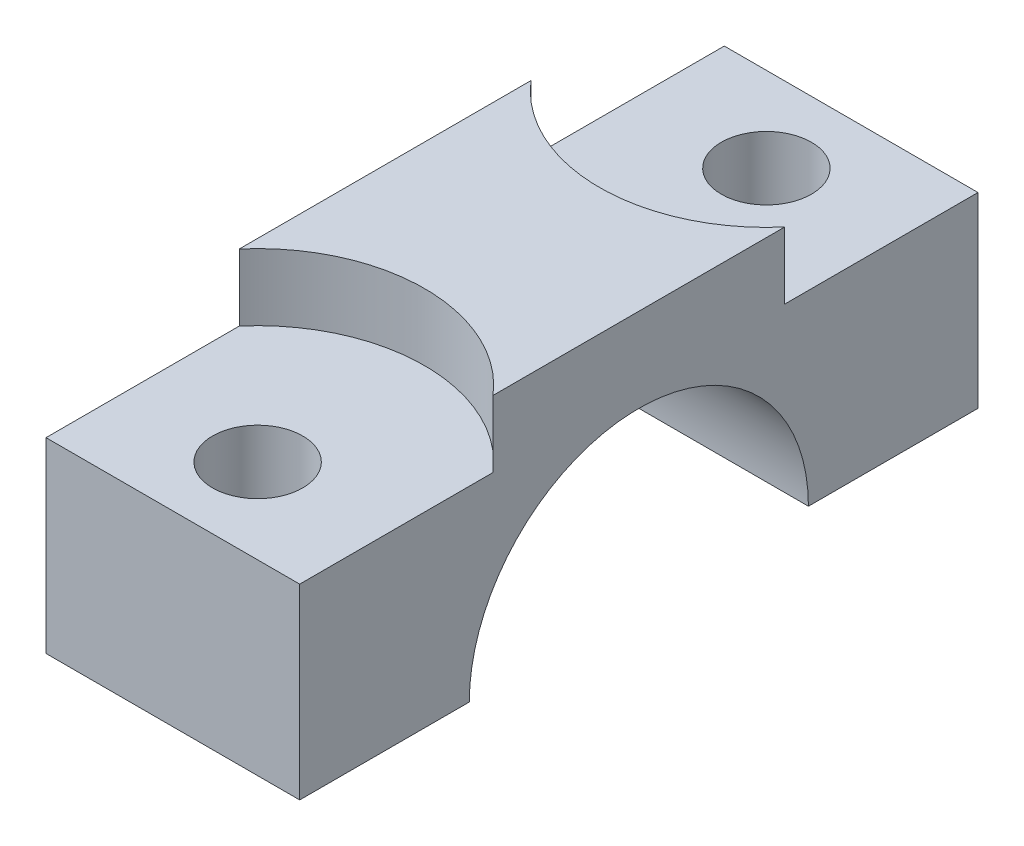
ISO-10303-21;
HEADER;
FILE_DESCRIPTION(('STEP AP214'),'2;1');
FILE_NAME('part.step','',(''),(''),'','','');
FILE_SCHEMA(('AUTOMOTIVE_DESIGN { 1 0 10303 214 1 1 1 1 }'));
ENDSEC;
DATA;
#1=APPLICATION_CONTEXT('core data for automotive mechanical design processes');
#2=APPLICATION_PROTOCOL_DEFINITION('international standard','automotive_design',2000,#1);
#3=PRODUCT_CONTEXT('',#1,'mechanical');
#4=PRODUCT('Part','Part','',(#3));
#5=PRODUCT_RELATED_PRODUCT_CATEGORY('part','',(#4));
#6=PRODUCT_DEFINITION_FORMATION('','',#4);
#7=PRODUCT_DEFINITION_CONTEXT('part definition',#1,'design');
#8=PRODUCT_DEFINITION('design','',#6,#7);
#9=PRODUCT_DEFINITION_SHAPE('','',#8);
#10=(LENGTH_UNIT() NAMED_UNIT(*) SI_UNIT(.MILLI.,.METRE.));
#11=(NAMED_UNIT(*) PLANE_ANGLE_UNIT() SI_UNIT($,.RADIAN.));
#12=(NAMED_UNIT(*) SI_UNIT($,.STERADIAN.) SOLID_ANGLE_UNIT());
#13=UNCERTAINTY_MEASURE_WITH_UNIT(LENGTH_MEASURE(1.E-05),#10,'distance_accuracy_value','');
#14=(GEOMETRIC_REPRESENTATION_CONTEXT(3) GLOBAL_UNCERTAINTY_ASSIGNED_CONTEXT((#13)) GLOBAL_UNIT_ASSIGNED_CONTEXT((#10,
#11,#12)) REPRESENTATION_CONTEXT('',''));
#15=CARTESIAN_POINT('',(0.,0.,0.));
#16=DIRECTION('',(0.,0.,1.));
#17=DIRECTION('',(1.,0.,0.));
#18=AXIS2_PLACEMENT_3D('',#15,#16,#17);
#19=CARTESIAN_POINT('',(9.5,19.,25.4));
#20=DIRECTION('',(0.,-1.,0.));
#21=DIRECTION('',(0.,0.,-1.));
#22=AXIS2_PLACEMENT_3D('',#19,#20,#21);
#23=PLANE('',#22);
#24=CARTESIAN_POINT('',(0.,19.,-19.05));
#25=DIRECTION('',(0.,1.,0.));
#26=DIRECTION('',(0.,0.,1.));
#27=AXIS2_PLACEMENT_3D('',#24,#25,#26);
#28=CIRCLE('',#27,12.5);
#29=CARTESIAN_POINT('',(-9.5,19.,-10.925961595364));
#30=VERTEX_POINT('',#29);
#31=CARTESIAN_POINT('',(9.5,19.,-10.925961595364));
#32=VERTEX_POINT('',#31);
#33=EDGE_CURVE('E120',#30,#32,#28,.T.);
#34=ORIENTED_EDGE('',*,*,#33,.F.);
#35=DIRECTION('',(0.,0.,1.));
#36=VECTOR('',#35,1.);
#37=CARTESIAN_POINT('',(-9.5,19.,25.4));
#38=LINE('',#37,#36);
#39=CARTESIAN_POINT('',(-9.5,19.,10.925961595364));
#40=VERTEX_POINT('',#39);
#41=EDGE_CURVE('E67',#30,#40,#38,.T.);
#42=ORIENTED_EDGE('',*,*,#41,.T.);
#43=CARTESIAN_POINT('',(0.,19.,19.05));
#44=DIRECTION('',(0.,1.,0.));
#45=DIRECTION('',(0.,0.,1.));
#46=AXIS2_PLACEMENT_3D('',#43,#44,#45);
#47=CIRCLE('',#46,12.5);
#48=CARTESIAN_POINT('',(9.5,19.,10.925961595364));
#49=VERTEX_POINT('',#48);
#50=EDGE_CURVE('E136',#49,#40,#47,.T.);
#51=ORIENTED_EDGE('',*,*,#50,.F.);
#52=DIRECTION('',(0.,0.,1.));
#53=VECTOR('',#52,1.);
#54=CARTESIAN_POINT('',(9.5,19.,25.4));
#55=LINE('',#54,#53);
#56=EDGE_CURVE('E131',#32,#49,#55,.T.);
#57=ORIENTED_EDGE('',*,*,#56,.F.);
#58=EDGE_LOOP('',(#34,#42,#51,#57));
#59=FACE_BOUND('',#58,.T.);
#60=ADVANCED_FACE('F43',(#59),#23,.F.);
#61=CARTESIAN_POINT('',(9.5,19.,-25.4));
#62=DIRECTION('',(0.,0.,1.));
#63=DIRECTION('',(0.,-1.,0.));
#64=AXIS2_PLACEMENT_3D('',#61,#62,#63);
#65=PLANE('',#64);
#66=DIRECTION('',(0.,1.,0.));
#67=VECTOR('',#66,1.);
#68=CARTESIAN_POINT('',(-9.5,19.,-25.4));
#69=LINE('',#68,#67);
#70=CARTESIAN_POINT('',(-9.5,0.,-25.4));
#71=VERTEX_POINT('',#70);
#72=CARTESIAN_POINT('',(-9.5,14.,-25.4));
#73=VERTEX_POINT('',#72);
#74=EDGE_CURVE('E158',#71,#73,#69,.T.);
#75=ORIENTED_EDGE('',*,*,#74,.T.);
#76=DIRECTION('',(1.,0.,0.));
#77=VECTOR('',#76,1.);
#78=CARTESIAN_POINT('',(9.5,14.,-25.4));
#79=LINE('',#78,#77);
#80=CARTESIAN_POINT('',(9.5,14.,-25.4));
#81=VERTEX_POINT('',#80);
#82=EDGE_CURVE('E251',#73,#81,#79,.T.);
#83=ORIENTED_EDGE('',*,*,#82,.T.);
#84=DIRECTION('',(0.,1.,0.));
#85=VECTOR('',#84,1.);
#86=CARTESIAN_POINT('',(9.5,19.,-25.4));
#87=LINE('',#86,#85);
#88=CARTESIAN_POINT('',(9.5,0.,-25.4));
#89=VERTEX_POINT('',#88);
#90=EDGE_CURVE('E139',#89,#81,#87,.T.);
#91=ORIENTED_EDGE('',*,*,#90,.F.);
#92=DIRECTION('',(-1.,0.,0.));
#93=VECTOR('',#92,1.);
#94=CARTESIAN_POINT('',(9.5,0.,-25.4));
#95=LINE('',#94,#93);
#96=EDGE_CURVE('E157',#89,#71,#95,.T.);
#97=ORIENTED_EDGE('',*,*,#96,.T.);
#98=EDGE_LOOP('',(#75,#83,#91,#97));
#99=FACE_BOUND('',#98,.T.);
#100=ADVANCED_FACE('F45',(#99),#65,.F.);
#101=CARTESIAN_POINT('',(9.5,19.,25.4));
#102=DIRECTION('',(0.,0.,-1.));
#103=DIRECTION('',(0.,1.,0.));
#104=AXIS2_PLACEMENT_3D('',#101,#102,#103);
#105=PLANE('',#104);
#106=DIRECTION('',(0.,-1.,0.));
#107=VECTOR('',#106,1.);
#108=CARTESIAN_POINT('',(9.5,19.,25.4));
#109=LINE('',#108,#107);
#110=CARTESIAN_POINT('',(9.5,14.,25.4));
#111=VERTEX_POINT('',#110);
#112=CARTESIAN_POINT('',(9.5,0.,25.4));
#113=VERTEX_POINT('',#112);
#114=EDGE_CURVE('E138',#111,#113,#109,.T.);
#115=ORIENTED_EDGE('',*,*,#114,.F.);
#116=DIRECTION('',(-1.,0.,0.));
#117=VECTOR('',#116,1.);
#118=CARTESIAN_POINT('',(9.5,14.,25.4));
#119=LINE('',#118,#117);
#120=CARTESIAN_POINT('',(-9.5,14.,25.4));
#121=VERTEX_POINT('',#120);
#122=EDGE_CURVE('E203',#111,#121,#119,.T.);
#123=ORIENTED_EDGE('',*,*,#122,.T.);
#124=DIRECTION('',(0.,-1.,0.));
#125=VECTOR('',#124,1.);
#126=CARTESIAN_POINT('',(-9.5,19.,25.4));
#127=LINE('',#126,#125);
#128=CARTESIAN_POINT('',(-9.5,0.,25.4));
#129=VERTEX_POINT('',#128);
#130=EDGE_CURVE('E165',#121,#129,#127,.T.);
#131=ORIENTED_EDGE('',*,*,#130,.T.);
#132=DIRECTION('',(-1.,0.,0.));
#133=VECTOR('',#132,1.);
#134=CARTESIAN_POINT('',(9.5,0.,25.4));
#135=LINE('',#134,#133);
#136=EDGE_CURVE('E187',#113,#129,#135,.T.);
#137=ORIENTED_EDGE('',*,*,#136,.F.);
#138=EDGE_LOOP('',(#115,#123,#131,#137));
#139=FACE_BOUND('',#138,.T.);
#140=ADVANCED_FACE('F212',(#139),#105,.F.);
#141=CARTESIAN_POINT('',(9.5,0.,25.4));
#142=DIRECTION('',(0.,1.,0.));
#143=DIRECTION('',(0.,0.,1.));
#144=AXIS2_PLACEMENT_3D('',#141,#142,#143);
#145=PLANE('',#144);
#146=CARTESIAN_POINT('',(0.,0.,19.05));
#147=DIRECTION('',(0.,1.,0.));
#148=DIRECTION('',(0.,0.,1.));
#149=AXIS2_PLACEMENT_3D('',#146,#147,#148);
#150=CIRCLE('',#149,3.375);
#151=CARTESIAN_POINT('',(0.,0.,22.425));
#152=VERTEX_POINT('',#151);
#153=EDGE_CURVE('E236',#152,#152,#150,.T.);
#154=ORIENTED_EDGE('',*,*,#153,.T.);
#155=EDGE_LOOP('',(#154));
#156=FACE_BOUND('',#155,.T.);
#157=DIRECTION('',(0.,0.,-1.));
#158=VECTOR('',#157,1.);
#159=CARTESIAN_POINT('',(-9.5,0.,25.4));
#160=LINE('',#159,#158);
#161=CARTESIAN_POINT('',(-9.5,0.,12.7));
#162=VERTEX_POINT('',#161);
#163=EDGE_CURVE('E168',#129,#162,#160,.T.);
#164=ORIENTED_EDGE('',*,*,#163,.T.);
#165=DIRECTION('',(-1.,0.,0.));
#166=VECTOR('',#165,1.);
#167=CARTESIAN_POINT('',(9.5,0.,12.7));
#168=LINE('',#167,#166);
#169=CARTESIAN_POINT('',(9.5,0.,12.7));
#170=VERTEX_POINT('',#169);
#171=EDGE_CURVE('E183',#170,#162,#168,.T.);
#172=ORIENTED_EDGE('',*,*,#171,.F.);
#173=DIRECTION('',(0.,0.,-1.));
#174=VECTOR('',#173,1.);
#175=CARTESIAN_POINT('',(9.5,0.,25.4));
#176=LINE('',#175,#174);
#177=EDGE_CURVE('E143',#113,#170,#176,.T.);
#178=ORIENTED_EDGE('',*,*,#177,.F.);
#179=ORIENTED_EDGE('',*,*,#136,.T.);
#180=EDGE_LOOP('',(#164,#172,#178,#179));
#181=FACE_BOUND('',#180,.T.);
#182=ADVANCED_FACE('F224',(#156,#181),#145,.F.);
#183=CARTESIAN_POINT('',(9.5,0.,0.));
#184=DIRECTION('',(-1.,0.,0.));
#185=DIRECTION('',(0.,0.,1.));
#186=AXIS2_PLACEMENT_3D('',#183,#184,#185);
#187=CYLINDRICAL_SURFACE('',#186,12.7);
#188=CARTESIAN_POINT('',(-9.5,0.,0.));
#189=DIRECTION('',(-1.,0.,0.));
#190=DIRECTION('',(0.,0.,1.));
#191=AXIS2_PLACEMENT_3D('',#188,#189,#190);
#192=CIRCLE('',#191,12.7);
#193=CARTESIAN_POINT('',(-9.5,0.,-12.7));
#194=VERTEX_POINT('',#193);
#195=EDGE_CURVE('E171',#162,#194,#192,.T.);
#196=ORIENTED_EDGE('',*,*,#195,.T.);
#197=DIRECTION('',(-1.,0.,0.));
#198=VECTOR('',#197,1.);
#199=CARTESIAN_POINT('',(9.5,0.,-12.7));
#200=LINE('',#199,#198);
#201=CARTESIAN_POINT('',(9.5,0.,-12.7));
#202=VERTEX_POINT('',#201);
#203=EDGE_CURVE('E179',#202,#194,#200,.T.);
#204=ORIENTED_EDGE('',*,*,#203,.F.);
#205=CARTESIAN_POINT('',(9.5,0.,0.));
#206=DIRECTION('',(-1.,0.,0.));
#207=DIRECTION('',(0.,0.,1.));
#208=AXIS2_PLACEMENT_3D('',#205,#206,#207);
#209=CIRCLE('',#208,12.7);
#210=EDGE_CURVE('E151',#170,#202,#209,.T.);
#211=ORIENTED_EDGE('',*,*,#210,.F.);
#212=ORIENTED_EDGE('',*,*,#171,.T.);
#213=EDGE_LOOP('',(#196,#204,#211,#212));
#214=FACE_BOUND('',#213,.T.);
#215=ADVANCED_FACE('F228',(#214),#187,.F.);
#216=CARTESIAN_POINT('',(9.5,0.,-12.7));
#217=DIRECTION('',(0.,1.,0.));
#218=DIRECTION('',(0.,0.,1.));
#219=AXIS2_PLACEMENT_3D('',#216,#217,#218);
#220=PLANE('',#219);
#221=CARTESIAN_POINT('',(0.,0.,-19.05));
#222=DIRECTION('',(0.,1.,0.));
#223=DIRECTION('',(0.,0.,1.));
#224=AXIS2_PLACEMENT_3D('',#221,#222,#223);
#225=CIRCLE('',#224,3.375);
#226=CARTESIAN_POINT('',(0.,0.,-15.675));
#227=VERTEX_POINT('',#226);
#228=EDGE_CURVE('E255',#227,#227,#225,.T.);
#229=ORIENTED_EDGE('',*,*,#228,.T.);
#230=EDGE_LOOP('',(#229));
#231=FACE_BOUND('',#230,.T.);
#232=DIRECTION('',(0.,0.,-1.));
#233=VECTOR('',#232,1.);
#234=CARTESIAN_POINT('',(-9.5,0.,-12.7));
#235=LINE('',#234,#233);
#236=EDGE_CURVE('E145',#194,#71,#235,.T.);
#237=ORIENTED_EDGE('',*,*,#236,.T.);
#238=ORIENTED_EDGE('',*,*,#96,.F.);
#239=DIRECTION('',(0.,0.,-1.));
#240=VECTOR('',#239,1.);
#241=CARTESIAN_POINT('',(9.5,0.,-12.7));
#242=LINE('',#241,#240);
#243=EDGE_CURVE('E154',#202,#89,#242,.T.);
#244=ORIENTED_EDGE('',*,*,#243,.F.);
#245=ORIENTED_EDGE('',*,*,#203,.T.);
#246=EDGE_LOOP('',(#237,#238,#244,#245));
#247=FACE_BOUND('',#246,.T.);
#248=ADVANCED_FACE('F290',(#231,#247),#220,.F.);
#249=CARTESIAN_POINT('',(9.5,0.,0.));
#250=DIRECTION('',(-1.,0.,0.));
#251=DIRECTION('',(0.,0.,1.));
#252=AXIS2_PLACEMENT_3D('',#249,#250,#251);
#253=PLANE('',#252);
#254=DIRECTION('',(0.,0.,1.));
#255=VECTOR('',#254,1.);
#256=CARTESIAN_POINT('',(9.5,14.,0.));
#257=LINE('',#256,#255);
#258=CARTESIAN_POINT('',(9.5,14.,-10.925961595364));
#259=VERTEX_POINT('',#258);
#260=EDGE_CURVE('E134',#81,#259,#257,.T.);
#261=ORIENTED_EDGE('',*,*,#260,.T.);
#262=DIRECTION('',(0.,1.,0.));
#263=VECTOR('',#262,1.);
#264=CARTESIAN_POINT('',(9.5,19.,-10.925961595364));
#265=LINE('',#264,#263);
#266=EDGE_CURVE('E52',#259,#32,#265,.T.);
#267=ORIENTED_EDGE('',*,*,#266,.T.);
#268=ORIENTED_EDGE('',*,*,#56,.T.);
#269=DIRECTION('',(0.,1.,0.));
#270=VECTOR('',#269,1.);
#271=CARTESIAN_POINT('',(9.5,19.,10.925961595364));
#272=LINE('',#271,#270);
#273=CARTESIAN_POINT('',(9.5,14.,10.925961595364));
#274=VERTEX_POINT('',#273);
#275=EDGE_CURVE('E215',#49,#274,#272,.F.);
#276=ORIENTED_EDGE('',*,*,#275,.T.);
#277=DIRECTION('',(0.,0.,1.));
#278=VECTOR('',#277,1.);
#279=CARTESIAN_POINT('',(9.5,14.,0.));
#280=LINE('',#279,#278);
#281=EDGE_CURVE('E162',#274,#111,#280,.T.);
#282=ORIENTED_EDGE('',*,*,#281,.T.);
#283=ORIENTED_EDGE('',*,*,#114,.T.);
#284=ORIENTED_EDGE('',*,*,#177,.T.);
#285=ORIENTED_EDGE('',*,*,#210,.T.);
#286=ORIENTED_EDGE('',*,*,#243,.T.);
#287=ORIENTED_EDGE('',*,*,#90,.T.);
#288=EDGE_LOOP('',(#261,#267,#268,#276,#282,#283,#284,#285,#286,#287));
#289=FACE_BOUND('',#288,.T.);
#290=ADVANCED_FACE('F129',(#289),#253,.F.);
#291=CARTESIAN_POINT('',(-9.5,0.,0.));
#292=DIRECTION('',(-1.,0.,0.));
#293=DIRECTION('',(0.,0.,1.));
#294=AXIS2_PLACEMENT_3D('',#291,#292,#293);
#295=PLANE('',#294);
#296=DIRECTION('',(0.,0.,1.));
#297=VECTOR('',#296,1.);
#298=CARTESIAN_POINT('',(-9.5,14.,0.));
#299=LINE('',#298,#297);
#300=CARTESIAN_POINT('',(-9.5,14.,-10.925961595364));
#301=VERTEX_POINT('',#300);
#302=EDGE_CURVE('E248',#73,#301,#299,.T.);
#303=ORIENTED_EDGE('',*,*,#302,.F.);
#304=ORIENTED_EDGE('',*,*,#74,.F.);
#305=ORIENTED_EDGE('',*,*,#236,.F.);
#306=ORIENTED_EDGE('',*,*,#195,.F.);
#307=ORIENTED_EDGE('',*,*,#163,.F.);
#308=ORIENTED_EDGE('',*,*,#130,.F.);
#309=DIRECTION('',(0.,0.,1.));
#310=VECTOR('',#309,1.);
#311=CARTESIAN_POINT('',(-9.5,14.,0.));
#312=LINE('',#311,#310);
#313=CARTESIAN_POINT('',(-9.5,14.,10.925961595364));
#314=VERTEX_POINT('',#313);
#315=EDGE_CURVE('E194',#314,#121,#312,.T.);
#316=ORIENTED_EDGE('',*,*,#315,.F.);
#317=DIRECTION('',(0.,1.,0.));
#318=VECTOR('',#317,1.);
#319=CARTESIAN_POINT('',(-9.5,19.,10.925961595364));
#320=LINE('',#319,#318);
#321=EDGE_CURVE('E191',#40,#314,#320,.F.);
#322=ORIENTED_EDGE('',*,*,#321,.F.);
#323=ORIENTED_EDGE('',*,*,#41,.F.);
#324=DIRECTION('',(0.,1.,0.));
#325=VECTOR('',#324,1.);
#326=CARTESIAN_POINT('',(-9.5,19.,-10.925961595364));
#327=LINE('',#326,#325);
#328=EDGE_CURVE('E11',#301,#30,#327,.T.);
#329=ORIENTED_EDGE('',*,*,#328,.F.);
#330=EDGE_LOOP('',(#303,#304,#305,#306,#307,#308,#316,#322,#323,#329));
#331=FACE_BOUND('',#330,.T.);
#332=ADVANCED_FACE('F219',(#331),#295,.T.);
#333=CARTESIAN_POINT('',(3.37500000000001,14.,19.05));
#334=DIRECTION('',(0.,-1.,0.));
#335=DIRECTION('',(0.,0.,-1.));
#336=AXIS2_PLACEMENT_3D('',#333,#334,#335);
#337=PLANE('',#336);
#338=CARTESIAN_POINT('',(0.,14.,19.05));
#339=DIRECTION('',(0.,1.,0.));
#340=DIRECTION('',(0.,0.,1.));
#341=AXIS2_PLACEMENT_3D('',#338,#339,#340);
#342=CIRCLE('',#341,3.37500000000001);
#343=CARTESIAN_POINT('',(0.,14.,22.425));
#344=VERTEX_POINT('',#343);
#345=EDGE_CURVE('E240',#344,#344,#342,.T.);
#346=ORIENTED_EDGE('',*,*,#345,.F.);
#347=EDGE_LOOP('',(#346));
#348=FACE_BOUND('',#347,.T.);
#349=CARTESIAN_POINT('',(0.,14.,19.05));
#350=DIRECTION('',(0.,1.,0.));
#351=DIRECTION('',(0.,0.,1.));
#352=AXIS2_PLACEMENT_3D('',#349,#350,#351);
#353=CIRCLE('',#352,12.5);
#354=EDGE_CURVE('E206',#274,#314,#353,.T.);
#355=ORIENTED_EDGE('',*,*,#354,.T.);
#356=ORIENTED_EDGE('',*,*,#315,.T.);
#357=ORIENTED_EDGE('',*,*,#122,.F.);
#358=ORIENTED_EDGE('',*,*,#281,.F.);
#359=EDGE_LOOP('',(#355,#356,#357,#358));
#360=FACE_BOUND('',#359,.T.);
#361=ADVANCED_FACE('F202',(#348,#360),#337,.F.);
#362=CARTESIAN_POINT('',(0.,19.,19.05));
#363=DIRECTION('',(0.,1.,0.));
#364=DIRECTION('',(0.,0.,1.));
#365=AXIS2_PLACEMENT_3D('',#362,#363,#364);
#366=CYLINDRICAL_SURFACE('',#365,12.5);
#367=ORIENTED_EDGE('',*,*,#50,.T.);
#368=ORIENTED_EDGE('',*,*,#321,.T.);
#369=ORIENTED_EDGE('',*,*,#354,.F.);
#370=ORIENTED_EDGE('',*,*,#275,.F.);
#371=EDGE_LOOP('',(#367,#368,#369,#370));
#372=FACE_BOUND('',#371,.T.);
#373=ADVANCED_FACE('F301',(#372),#366,.F.);
#374=CARTESIAN_POINT('',(0.,19.,19.05));
#375=DIRECTION('',(0.,1.,0.));
#376=DIRECTION('',(0.,0.,1.));
#377=AXIS2_PLACEMENT_3D('',#374,#375,#376);
#378=CYLINDRICAL_SURFACE('',#377,3.375);
#379=ORIENTED_EDGE('',*,*,#153,.F.);
#380=EDGE_LOOP('',(#379));
#381=FACE_BOUND('',#380,.T.);
#382=ORIENTED_EDGE('',*,*,#345,.T.);
#383=EDGE_LOOP('',(#382));
#384=FACE_BOUND('',#383,.T.);
#385=ADVANCED_FACE('F298',(#381,#384),#378,.F.);
#386=CARTESIAN_POINT('',(0.,19.,-19.05));
#387=DIRECTION('',(0.,1.,0.));
#388=DIRECTION('',(0.,0.,1.));
#389=AXIS2_PLACEMENT_3D('',#386,#387,#388);
#390=CYLINDRICAL_SURFACE('',#389,12.5);
#391=CARTESIAN_POINT('',(0.,14.,-19.05));
#392=DIRECTION('',(0.,1.,0.));
#393=DIRECTION('',(0.,0.,1.));
#394=AXIS2_PLACEMENT_3D('',#391,#392,#393);
#395=CIRCLE('',#394,12.5);
#396=EDGE_CURVE('E59',#301,#259,#395,.T.);
#397=ORIENTED_EDGE('',*,*,#396,.F.);
#398=ORIENTED_EDGE('',*,*,#328,.T.);
#399=ORIENTED_EDGE('',*,*,#33,.T.);
#400=ORIENTED_EDGE('',*,*,#266,.F.);
#401=EDGE_LOOP('',(#397,#398,#399,#400));
#402=FACE_BOUND('',#401,.T.);
#403=ADVANCED_FACE('F122',(#402),#390,.F.);
#404=CARTESIAN_POINT('',(0.,19.,-19.05));
#405=DIRECTION('',(0.,1.,0.));
#406=DIRECTION('',(0.,0.,1.));
#407=AXIS2_PLACEMENT_3D('',#404,#405,#406);
#408=CYLINDRICAL_SURFACE('',#407,3.375);
#409=ORIENTED_EDGE('',*,*,#228,.F.);
#410=EDGE_LOOP('',(#409));
#411=FACE_BOUND('',#410,.T.);
#412=CARTESIAN_POINT('',(0.,14.,-19.05));
#413=DIRECTION('',(0.,1.,0.));
#414=DIRECTION('',(0.,0.,1.));
#415=AXIS2_PLACEMENT_3D('',#412,#413,#414);
#416=CIRCLE('',#415,3.37500000000001);
#417=CARTESIAN_POINT('',(0.,14.,-15.675));
#418=VERTEX_POINT('',#417);
#419=EDGE_CURVE('E259',#418,#418,#416,.T.);
#420=ORIENTED_EDGE('',*,*,#419,.T.);
#421=EDGE_LOOP('',(#420));
#422=FACE_BOUND('',#421,.T.);
#423=ADVANCED_FACE('F266',(#411,#422),#408,.F.);
#424=CARTESIAN_POINT('',(3.37500000000001,14.,-19.05));
#425=DIRECTION('',(0.,-1.,0.));
#426=DIRECTION('',(0.,0.,-1.));
#427=AXIS2_PLACEMENT_3D('',#424,#425,#426);
#428=PLANE('',#427);
#429=ORIENTED_EDGE('',*,*,#302,.T.);
#430=ORIENTED_EDGE('',*,*,#396,.T.);
#431=ORIENTED_EDGE('',*,*,#260,.F.);
#432=ORIENTED_EDGE('',*,*,#82,.F.);
#433=EDGE_LOOP('',(#429,#430,#431,#432));
#434=FACE_BOUND('',#433,.T.);
#435=ORIENTED_EDGE('',*,*,#419,.F.);
#436=EDGE_LOOP('',(#435));
#437=FACE_BOUND('',#436,.T.);
#438=ADVANCED_FACE('F268',(#434,#437),#428,.F.);
#439=CLOSED_SHELL('',(#60,#100,#140,#182,#215,#248,#290,#332,#361,#373,#385,#403,#423,#438));
#440=MANIFOLD_SOLID_BREP('B2',#439);
#441=ADVANCED_BREP_SHAPE_REPRESENTATION('',(#18,#440),#14);
#442=SHAPE_DEFINITION_REPRESENTATION(#9,#441);
ENDSEC;
END-ISO-10303-21;
